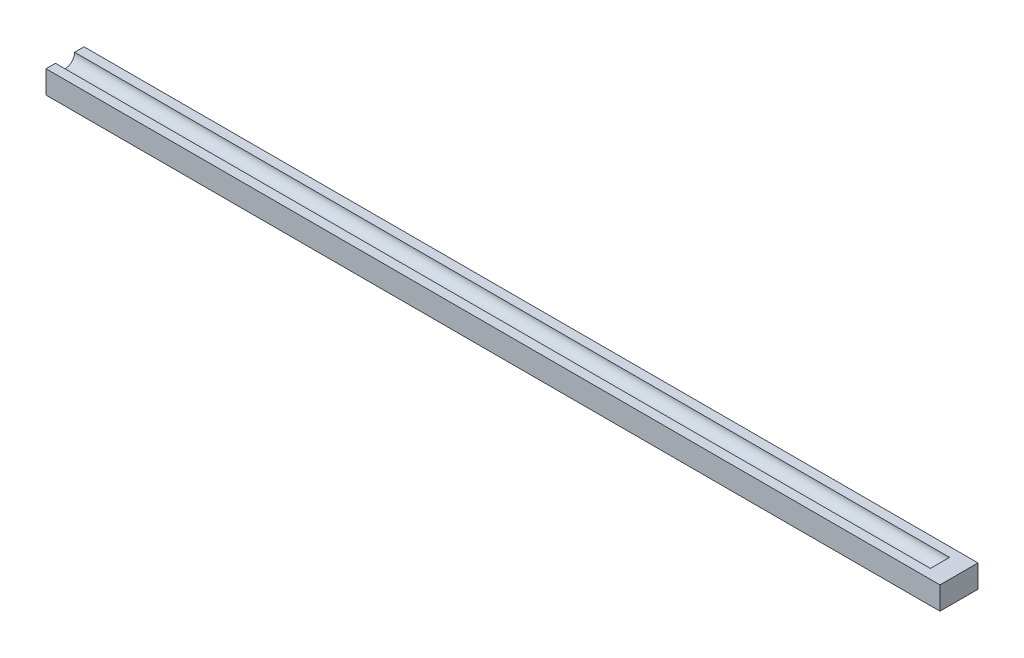
ISO-10303-21;
HEADER;
FILE_DESCRIPTION(('STEP AP214'),'2;1');
FILE_NAME('part.step','',(''),(''),'','','');
FILE_SCHEMA(('AUTOMOTIVE_DESIGN { 1 0 10303 214 1 1 1 1 }'));
ENDSEC;
DATA;
#1=APPLICATION_CONTEXT('core data for automotive mechanical design processes');
#2=APPLICATION_PROTOCOL_DEFINITION('international standard','automotive_design',2000,#1);
#3=PRODUCT_CONTEXT('',#1,'mechanical');
#4=PRODUCT('Part','Part','',(#3));
#5=PRODUCT_RELATED_PRODUCT_CATEGORY('part','',(#4));
#6=PRODUCT_DEFINITION_FORMATION('','',#4);
#7=PRODUCT_DEFINITION_CONTEXT('part definition',#1,'design');
#8=PRODUCT_DEFINITION('design','',#6,#7);
#9=PRODUCT_DEFINITION_SHAPE('','',#8);
#10=(LENGTH_UNIT() NAMED_UNIT(*) SI_UNIT(.MILLI.,.METRE.));
#11=(NAMED_UNIT(*) PLANE_ANGLE_UNIT() SI_UNIT($,.RADIAN.));
#12=(NAMED_UNIT(*) SI_UNIT($,.STERADIAN.) SOLID_ANGLE_UNIT());
#13=UNCERTAINTY_MEASURE_WITH_UNIT(LENGTH_MEASURE(1.E-05),#10,'distance_accuracy_value','');
#14=(GEOMETRIC_REPRESENTATION_CONTEXT(3) GLOBAL_UNCERTAINTY_ASSIGNED_CONTEXT((#13)) GLOBAL_UNIT_ASSIGNED_CONTEXT((#10,
#11,#12)) REPRESENTATION_CONTEXT('',''));
#15=CARTESIAN_POINT('',(0.,0.,0.));
#16=DIRECTION('',(0.,0.,1.));
#17=DIRECTION('',(1.,0.,0.));
#18=AXIS2_PLACEMENT_3D('',#15,#16,#17);
#19=CARTESIAN_POINT('',(0.,6.,5.));
#20=DIRECTION('',(1.,0.,0.));
#21=DIRECTION('',(0.,0.,-1.));
#22=AXIS2_PLACEMENT_3D('',#19,#20,#21);
#23=PLANE('',#22);
#24=DIRECTION('',(0.,0.,1.));
#25=VECTOR('',#24,1.);
#26=CARTESIAN_POINT('',(0.,6.,5.));
#27=LINE('',#26,#25);
#28=CARTESIAN_POINT('',(0.,6.,2.515));
#29=VERTEX_POINT('',#28);
#30=CARTESIAN_POINT('',(0.,6.,5.));
#31=VERTEX_POINT('',#30);
#32=EDGE_CURVE('E88',#29,#31,#27,.T.);
#33=ORIENTED_EDGE('',*,*,#32,.F.);
#34=CARTESIAN_POINT('',(0.,6.,0.));
#35=DIRECTION('',(-1.,0.,0.));
#36=DIRECTION('',(0.,0.,1.));
#37=AXIS2_PLACEMENT_3D('',#34,#35,#36);
#38=CIRCLE('',#37,2.515);
#39=CARTESIAN_POINT('',(0.,6.,-2.515));
#40=VERTEX_POINT('',#39);
#41=EDGE_CURVE('E99',#40,#29,#38,.T.);
#42=ORIENTED_EDGE('',*,*,#41,.F.);
#43=CARTESIAN_POINT('',(0.,6.,-5.));
#44=VERTEX_POINT('',#43);
#45=EDGE_CURVE('E112',#44,#40,#27,.T.);
#46=ORIENTED_EDGE('',*,*,#45,.F.);
#47=DIRECTION('',(0.,-1.,0.));
#48=VECTOR('',#47,1.);
#49=CARTESIAN_POINT('',(0.,6.,-5.));
#50=LINE('',#49,#48);
#51=CARTESIAN_POINT('',(0.,0.,-5.));
#52=VERTEX_POINT('',#51);
#53=EDGE_CURVE('E123',#44,#52,#50,.T.);
#54=ORIENTED_EDGE('',*,*,#53,.T.);
#55=DIRECTION('',(0.,0.,1.));
#56=VECTOR('',#55,1.);
#57=CARTESIAN_POINT('',(0.,0.,5.));
#58=LINE('',#57,#56);
#59=CARTESIAN_POINT('',(0.,0.,5.));
#60=VERTEX_POINT('',#59);
#61=EDGE_CURVE('E124',#52,#60,#58,.T.);
#62=ORIENTED_EDGE('',*,*,#61,.T.);
#63=DIRECTION('',(0.,-1.,0.));
#64=VECTOR('',#63,1.);
#65=CARTESIAN_POINT('',(0.,6.,5.));
#66=LINE('',#65,#64);
#67=EDGE_CURVE('E111',#31,#60,#66,.T.);
#68=ORIENTED_EDGE('',*,*,#67,.F.);
#69=EDGE_LOOP('',(#33,#42,#46,#54,#62,#68));
#70=FACE_BOUND('',#69,.T.);
#71=ADVANCED_FACE('F39',(#70),#23,.F.);
#72=CARTESIAN_POINT('',(0.,6.,5.));
#73=DIRECTION('',(0.,0.,-1.));
#74=DIRECTION('',(-1.,0.,0.));
#75=AXIS2_PLACEMENT_3D('',#72,#73,#74);
#76=PLANE('',#75);
#77=DIRECTION('',(1.,0.,0.));
#78=VECTOR('',#77,1.);
#79=CARTESIAN_POINT('',(0.,0.,5.));
#80=LINE('',#79,#78);
#81=CARTESIAN_POINT('',(235.,0.,4.99999999999991));
#82=VERTEX_POINT('',#81);
#83=EDGE_CURVE('E126',#60,#82,#80,.T.);
#84=ORIENTED_EDGE('',*,*,#83,.T.);
#85=DIRECTION('',(0.,-1.,0.));
#86=VECTOR('',#85,1.);
#87=CARTESIAN_POINT('',(235.,6.,4.99999999999991));
#88=LINE('',#87,#86);
#89=CARTESIAN_POINT('',(235.,6.,4.99999999999991));
#90=VERTEX_POINT('',#89);
#91=EDGE_CURVE('E132',#90,#82,#88,.T.);
#92=ORIENTED_EDGE('',*,*,#91,.F.);
#93=DIRECTION('',(1.,0.,0.));
#94=VECTOR('',#93,1.);
#95=CARTESIAN_POINT('',(0.,6.,5.));
#96=LINE('',#95,#94);
#97=EDGE_CURVE('E114',#31,#90,#96,.T.);
#98=ORIENTED_EDGE('',*,*,#97,.F.);
#99=ORIENTED_EDGE('',*,*,#67,.T.);
#100=EDGE_LOOP('',(#84,#92,#98,#99));
#101=FACE_BOUND('',#100,.T.);
#102=ADVANCED_FACE('F142',(#101),#76,.F.);
#103=CARTESIAN_POINT('',(235.,6.,4.99999999999991));
#104=DIRECTION('',(-1.,0.,0.));
#105=DIRECTION('',(0.,0.,1.));
#106=AXIS2_PLACEMENT_3D('',#103,#104,#105);
#107=PLANE('',#106);
#108=DIRECTION('',(0.,0.,-1.));
#109=VECTOR('',#108,1.);
#110=CARTESIAN_POINT('',(235.,0.,4.99999999999991));
#111=LINE('',#110,#109);
#112=CARTESIAN_POINT('',(235.,0.,-5.));
#113=VERTEX_POINT('',#112);
#114=EDGE_CURVE('E115',#82,#113,#111,.T.);
#115=ORIENTED_EDGE('',*,*,#114,.T.);
#116=DIRECTION('',(0.,-1.,0.));
#117=VECTOR('',#116,1.);
#118=CARTESIAN_POINT('',(235.,6.,-5.));
#119=LINE('',#118,#117);
#120=CARTESIAN_POINT('',(235.,6.,-5.));
#121=VERTEX_POINT('',#120);
#122=EDGE_CURVE('E130',#121,#113,#119,.T.);
#123=ORIENTED_EDGE('',*,*,#122,.F.);
#124=DIRECTION('',(0.,0.,-1.));
#125=VECTOR('',#124,1.);
#126=CARTESIAN_POINT('',(235.,6.,4.99999999999991));
#127=LINE('',#126,#125);
#128=EDGE_CURVE('E120',#90,#121,#127,.T.);
#129=ORIENTED_EDGE('',*,*,#128,.F.);
#130=ORIENTED_EDGE('',*,*,#91,.T.);
#131=EDGE_LOOP('',(#115,#123,#129,#130));
#132=FACE_BOUND('',#131,.T.);
#133=ADVANCED_FACE('F146',(#132),#107,.F.);
#134=CARTESIAN_POINT('',(0.,6.,-5.));
#135=DIRECTION('',(0.,0.,1.));
#136=DIRECTION('',(1.,0.,0.));
#137=AXIS2_PLACEMENT_3D('',#134,#135,#136);
#138=PLANE('',#137);
#139=DIRECTION('',(-1.,0.,0.));
#140=VECTOR('',#139,1.);
#141=CARTESIAN_POINT('',(0.,0.,-5.));
#142=LINE('',#141,#140);
#143=EDGE_CURVE('E82',#113,#52,#142,.T.);
#144=ORIENTED_EDGE('',*,*,#143,.T.);
#145=ORIENTED_EDGE('',*,*,#53,.F.);
#146=DIRECTION('',(-1.,0.,0.));
#147=VECTOR('',#146,1.);
#148=CARTESIAN_POINT('',(0.,6.,-5.));
#149=LINE('',#148,#147);
#150=EDGE_CURVE('E61',#121,#44,#149,.T.);
#151=ORIENTED_EDGE('',*,*,#150,.F.);
#152=ORIENTED_EDGE('',*,*,#122,.T.);
#153=EDGE_LOOP('',(#144,#145,#151,#152));
#154=FACE_BOUND('',#153,.T.);
#155=ADVANCED_FACE('F147',(#154),#138,.F.);
#156=CARTESIAN_POINT('',(0.,6.,0.));
#157=DIRECTION('',(0.,-1.,0.));
#158=DIRECTION('',(0.,0.,-1.));
#159=AXIS2_PLACEMENT_3D('',#156,#157,#158);
#160=PLANE('',#159);
#161=DIRECTION('',(0.,0.,-1.));
#162=VECTOR('',#161,1.);
#163=CARTESIAN_POINT('',(230.,6.,0.));
#164=LINE('',#163,#162);
#165=CARTESIAN_POINT('',(230.,6.,2.51499999999996));
#166=VERTEX_POINT('',#165);
#167=CARTESIAN_POINT('',(230.,6.,-2.51500000000004));
#168=VERTEX_POINT('',#167);
#169=EDGE_CURVE('E107',#166,#168,#164,.T.);
#170=ORIENTED_EDGE('',*,*,#169,.F.);
#171=DIRECTION('',(-1.,0.,0.));
#172=VECTOR('',#171,1.);
#173=CARTESIAN_POINT('',(230.,6.,2.51499999999996));
#174=LINE('',#173,#172);
#175=EDGE_CURVE('E11',#166,#29,#174,.T.);
#176=ORIENTED_EDGE('',*,*,#175,.T.);
#177=ORIENTED_EDGE('',*,*,#32,.T.);
#178=ORIENTED_EDGE('',*,*,#97,.T.);
#179=ORIENTED_EDGE('',*,*,#128,.T.);
#180=ORIENTED_EDGE('',*,*,#150,.T.);
#181=ORIENTED_EDGE('',*,*,#45,.T.);
#182=DIRECTION('',(-1.,0.,0.));
#183=VECTOR('',#182,1.);
#184=CARTESIAN_POINT('',(230.,6.,-2.51500000000004));
#185=LINE('',#184,#183);
#186=EDGE_CURVE('E46',#40,#168,#185,.F.);
#187=ORIENTED_EDGE('',*,*,#186,.T.);
#188=EDGE_LOOP('',(#170,#176,#177,#178,#179,#180,#181,#187));
#189=FACE_BOUND('',#188,.T.);
#190=ADVANCED_FACE('F106',(#189),#160,.F.);
#191=CARTESIAN_POINT('',(0.,0.,0.));
#192=DIRECTION('',(0.,-1.,0.));
#193=DIRECTION('',(0.,0.,-1.));
#194=AXIS2_PLACEMENT_3D('',#191,#192,#193);
#195=PLANE('',#194);
#196=ORIENTED_EDGE('',*,*,#61,.F.);
#197=ORIENTED_EDGE('',*,*,#143,.F.);
#198=ORIENTED_EDGE('',*,*,#114,.F.);
#199=ORIENTED_EDGE('',*,*,#83,.F.);
#200=EDGE_LOOP('',(#196,#197,#198,#199));
#201=FACE_BOUND('',#200,.T.);
#202=ADVANCED_FACE('F138',(#201),#195,.T.);
#203=CARTESIAN_POINT('',(230.,6.,0.));
#204=DIRECTION('',(-1.,0.,0.));
#205=DIRECTION('',(0.,0.,1.));
#206=AXIS2_PLACEMENT_3D('',#203,#204,#205);
#207=CYLINDRICAL_SURFACE('',#206,2.515);
#208=CARTESIAN_POINT('',(230.,6.,0.));
#209=DIRECTION('',(-1.,0.,0.));
#210=DIRECTION('',(0.,0.,1.));
#211=AXIS2_PLACEMENT_3D('',#208,#209,#210);
#212=CIRCLE('',#211,2.515);
#213=EDGE_CURVE('E52',#168,#166,#212,.T.);
#214=ORIENTED_EDGE('',*,*,#213,.F.);
#215=ORIENTED_EDGE('',*,*,#186,.F.);
#216=ORIENTED_EDGE('',*,*,#41,.T.);
#217=ORIENTED_EDGE('',*,*,#175,.F.);
#218=EDGE_LOOP('',(#214,#215,#216,#217));
#219=FACE_BOUND('',#218,.T.);
#220=ADVANCED_FACE('F100',(#219),#207,.F.);
#221=CARTESIAN_POINT('',(230.,6.,0.));
#222=DIRECTION('',(-1.,0.,0.));
#223=DIRECTION('',(0.,0.,1.));
#224=AXIS2_PLACEMENT_3D('',#221,#222,#223);
#225=PLANE('',#224);
#226=ORIENTED_EDGE('',*,*,#169,.T.);
#227=ORIENTED_EDGE('',*,*,#213,.T.);
#228=EDGE_LOOP('',(#226,#227));
#229=FACE_BOUND('',#228,.T.);
#230=ADVANCED_FACE('F195',(#229),#225,.T.);
#231=CLOSED_SHELL('',(#71,#102,#133,#155,#190,#202,#220,#230));
#232=MANIFOLD_SOLID_BREP('B2',#231);
#233=ADVANCED_BREP_SHAPE_REPRESENTATION('',(#18,#232),#14);
#234=SHAPE_DEFINITION_REPRESENTATION(#9,#233);
ENDSEC;
END-ISO-10303-21;
